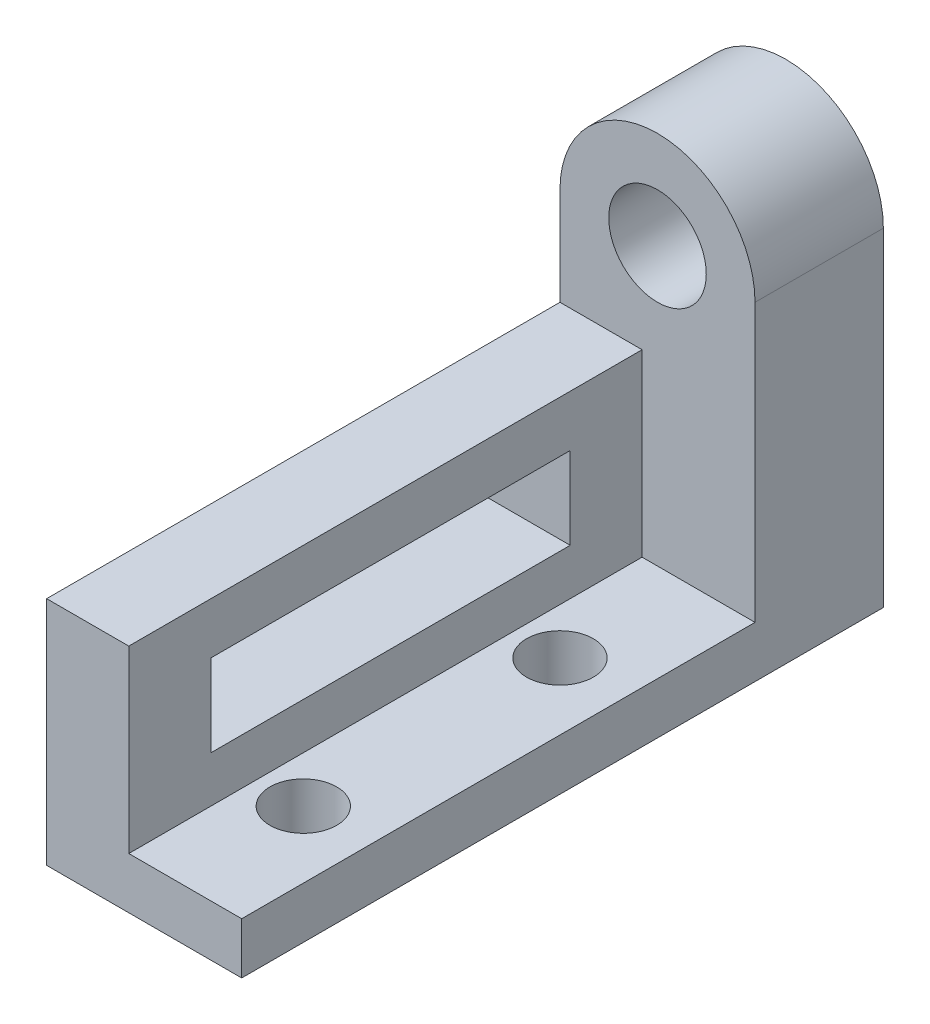
ISO-10303-21;
HEADER;
FILE_DESCRIPTION(('STEP AP214'),'2;1');
FILE_NAME('part.step','',(''),(''),'','','');
FILE_SCHEMA(('AUTOMOTIVE_DESIGN { 1 0 10303 214 1 1 1 1 }'));
ENDSEC;
DATA;
#1=APPLICATION_CONTEXT('core data for automotive mechanical design processes');
#2=APPLICATION_PROTOCOL_DEFINITION('international standard','automotive_design',2000,#1);
#3=PRODUCT_CONTEXT('',#1,'mechanical');
#4=PRODUCT('Part','Part','',(#3));
#5=PRODUCT_RELATED_PRODUCT_CATEGORY('part','',(#4));
#6=PRODUCT_DEFINITION_FORMATION('','',#4);
#7=PRODUCT_DEFINITION_CONTEXT('part definition',#1,'design');
#8=PRODUCT_DEFINITION('design','',#6,#7);
#9=PRODUCT_DEFINITION_SHAPE('','',#8);
#10=(LENGTH_UNIT() NAMED_UNIT(*) SI_UNIT(.MILLI.,.METRE.));
#11=(NAMED_UNIT(*) PLANE_ANGLE_UNIT() SI_UNIT($,.RADIAN.));
#12=(NAMED_UNIT(*) SI_UNIT($,.STERADIAN.) SOLID_ANGLE_UNIT());
#13=UNCERTAINTY_MEASURE_WITH_UNIT(LENGTH_MEASURE(1.E-05),#10,'distance_accuracy_value','');
#14=(GEOMETRIC_REPRESENTATION_CONTEXT(3) GLOBAL_UNCERTAINTY_ASSIGNED_CONTEXT((#13)) GLOBAL_UNIT_ASSIGNED_CONTEXT((#10,
#11,#12)) REPRESENTATION_CONTEXT('',''));
#15=CARTESIAN_POINT('',(0.,0.,0.));
#16=DIRECTION('',(0.,0.,1.));
#17=DIRECTION('',(1.,0.,0.));
#18=AXIS2_PLACEMENT_3D('',#15,#16,#17);
#19=CARTESIAN_POINT('',(19.,64.,-125.));
#20=DIRECTION('',(0.,0.,-1.));
#21=DIRECTION('',(-1.,0.,0.));
#22=AXIS2_PLACEMENT_3D('',#19,#20,#21);
#23=CYLINDRICAL_SURFACE('',#22,19.);
#24=DIRECTION('',(0.,0.,-1.));
#25=VECTOR('',#24,1.);
#26=CARTESIAN_POINT('',(38.,64.,0.));
#27=LINE('',#26,#25);
#28=CARTESIAN_POINT('',(38.,64.,-125.));
#29=VERTEX_POINT('',#28);
#30=CARTESIAN_POINT('',(38.,64.,-100.));
#31=VERTEX_POINT('',#30);
#32=EDGE_CURVE('E226',#29,#31,#27,.F.);
#33=ORIENTED_EDGE('',*,*,#32,.F.);
#34=CARTESIAN_POINT('',(19.,64.,-125.));
#35=DIRECTION('',(0.,0.,1.));
#36=DIRECTION('',(1.,0.,0.));
#37=AXIS2_PLACEMENT_3D('',#34,#35,#36);
#38=CIRCLE('',#37,19.);
#39=CARTESIAN_POINT('',(0.,64.,-125.));
#40=VERTEX_POINT('',#39);
#41=EDGE_CURVE('E50',#40,#29,#38,.F.);
#42=ORIENTED_EDGE('',*,*,#41,.F.);
#43=DIRECTION('',(0.,0.,1.));
#44=VECTOR('',#43,1.);
#45=CARTESIAN_POINT('',(0.,64.,-125.));
#46=LINE('',#45,#44);
#47=CARTESIAN_POINT('',(0.,64.,-100.));
#48=VERTEX_POINT('',#47);
#49=EDGE_CURVE('E229',#48,#40,#46,.F.);
#50=ORIENTED_EDGE('',*,*,#49,.F.);
#51=CARTESIAN_POINT('',(19.,64.,-100.));
#52=DIRECTION('',(0.,0.,1.));
#53=DIRECTION('',(1.,0.,0.));
#54=AXIS2_PLACEMENT_3D('',#51,#52,#53);
#55=CIRCLE('',#54,19.);
#56=EDGE_CURVE('E11',#31,#48,#55,.T.);
#57=ORIENTED_EDGE('',*,*,#56,.F.);
#58=EDGE_LOOP('',(#33,#42,#50,#57));
#59=FACE_BOUND('',#58,.T.);
#60=ADVANCED_FACE('F43',(#59),#23,.T.);
#61=CARTESIAN_POINT('',(38.,0.,-100.));
#62=DIRECTION('',(0.,0.,1.));
#63=DIRECTION('',(1.,0.,0.));
#64=AXIS2_PLACEMENT_3D('',#61,#62,#63);
#65=PLANE('',#64);
#66=CARTESIAN_POINT('',(19.,64.,-100.));
#67=DIRECTION('',(0.,0.,1.));
#68=DIRECTION('',(1.,0.,0.));
#69=AXIS2_PLACEMENT_3D('',#66,#67,#68);
#70=CIRCLE('',#69,9.5);
#71=CARTESIAN_POINT('',(28.5,64.,-100.));
#72=VERTEX_POINT('',#71);
#73=EDGE_CURVE('E433',#72,#72,#70,.T.);
#74=ORIENTED_EDGE('',*,*,#73,.F.);
#75=EDGE_LOOP('',(#74));
#76=FACE_BOUND('',#75,.T.);
#77=DIRECTION('',(0.,1.,0.));
#78=VECTOR('',#77,1.);
#79=CARTESIAN_POINT('',(38.,0.,-100.));
#80=LINE('',#79,#78);
#81=CARTESIAN_POINT('',(38.,10.,-100.));
#82=VERTEX_POINT('',#81);
#83=EDGE_CURVE('E196',#82,#31,#80,.T.);
#84=ORIENTED_EDGE('',*,*,#83,.T.);
#85=ORIENTED_EDGE('',*,*,#56,.T.);
#86=DIRECTION('',(0.,1.,0.));
#87=VECTOR('',#86,1.);
#88=CARTESIAN_POINT('',(0.,0.,-100.));
#89=LINE('',#88,#87);
#90=CARTESIAN_POINT('',(0.,45.,-100.));
#91=VERTEX_POINT('',#90);
#92=EDGE_CURVE('E194',#91,#48,#89,.T.);
#93=ORIENTED_EDGE('',*,*,#92,.F.);
#94=DIRECTION('',(-1.,0.,0.));
#95=VECTOR('',#94,1.);
#96=CARTESIAN_POINT('',(16.,45.,-100.));
#97=LINE('',#96,#95);
#98=CARTESIAN_POINT('',(16.,45.,-100.));
#99=VERTEX_POINT('',#98);
#100=EDGE_CURVE('E141',#99,#91,#97,.T.);
#101=ORIENTED_EDGE('',*,*,#100,.F.);
#102=DIRECTION('',(0.,1.,0.));
#103=VECTOR('',#102,1.);
#104=CARTESIAN_POINT('',(16.,0.,-100.));
#105=LINE('',#104,#103);
#106=CARTESIAN_POINT('',(16.,10.,-100.));
#107=VERTEX_POINT('',#106);
#108=EDGE_CURVE('E149',#107,#99,#105,.T.);
#109=ORIENTED_EDGE('',*,*,#108,.F.);
#110=DIRECTION('',(-1.,0.,0.));
#111=VECTOR('',#110,1.);
#112=CARTESIAN_POINT('',(38.,10.,-100.));
#113=LINE('',#112,#111);
#114=EDGE_CURVE('E223',#82,#107,#113,.T.);
#115=ORIENTED_EDGE('',*,*,#114,.F.);
#116=EDGE_LOOP('',(#84,#85,#93,#101,#109,#115));
#117=FACE_BOUND('',#116,.T.);
#118=ADVANCED_FACE('F247',(#76,#117),#65,.T.);
#119=CARTESIAN_POINT('',(38.,10.,0.));
#120=DIRECTION('',(0.,1.,0.));
#121=DIRECTION('',(0.,0.,1.));
#122=AXIS2_PLACEMENT_3D('',#119,#120,#121);
#123=PLANE('',#122);
#124=CARTESIAN_POINT('',(25.,10.,-25.));
#125=DIRECTION('',(0.,1.,0.));
#126=DIRECTION('',(0.,0.,1.));
#127=AXIS2_PLACEMENT_3D('',#124,#125,#126);
#128=CIRCLE('',#127,6.5);
#129=CARTESIAN_POINT('',(25.,10.,-18.5));
#130=VERTEX_POINT('',#129);
#131=EDGE_CURVE('E423',#130,#130,#128,.T.);
#132=ORIENTED_EDGE('',*,*,#131,.F.);
#133=EDGE_LOOP('',(#132));
#134=FACE_BOUND('',#133,.T.);
#135=CARTESIAN_POINT('',(25.,10.,-75.));
#136=DIRECTION('',(0.,1.,0.));
#137=DIRECTION('',(0.,0.,1.));
#138=AXIS2_PLACEMENT_3D('',#135,#136,#137);
#139=CIRCLE('',#138,6.5);
#140=CARTESIAN_POINT('',(25.,10.,-68.5));
#141=VERTEX_POINT('',#140);
#142=EDGE_CURVE('E425',#141,#141,#139,.T.);
#143=ORIENTED_EDGE('',*,*,#142,.F.);
#144=EDGE_LOOP('',(#143));
#145=FACE_BOUND('',#144,.T.);
#146=DIRECTION('',(0.,0.,-1.));
#147=VECTOR('',#146,1.);
#148=CARTESIAN_POINT('',(16.,10.,0.));
#149=LINE('',#148,#147);
#150=CARTESIAN_POINT('',(16.,10.,0.));
#151=VERTEX_POINT('',#150);
#152=EDGE_CURVE('E156',#151,#107,#149,.T.);
#153=ORIENTED_EDGE('',*,*,#152,.F.);
#154=DIRECTION('',(-1.,0.,0.));
#155=VECTOR('',#154,1.);
#156=CARTESIAN_POINT('',(38.,10.,0.));
#157=LINE('',#156,#155);
#158=CARTESIAN_POINT('',(38.,10.,0.));
#159=VERTEX_POINT('',#158);
#160=EDGE_CURVE('E155',#159,#151,#157,.T.);
#161=ORIENTED_EDGE('',*,*,#160,.F.);
#162=DIRECTION('',(0.,0.,-1.));
#163=VECTOR('',#162,1.);
#164=CARTESIAN_POINT('',(38.,10.,0.));
#165=LINE('',#164,#163);
#166=EDGE_CURVE('E198',#159,#82,#165,.T.);
#167=ORIENTED_EDGE('',*,*,#166,.T.);
#168=ORIENTED_EDGE('',*,*,#114,.T.);
#169=EDGE_LOOP('',(#153,#161,#167,#168));
#170=FACE_BOUND('',#169,.T.);
#171=ADVANCED_FACE('F249',(#134,#145,#170),#123,.T.);
#172=CARTESIAN_POINT('',(38.,0.,0.));
#173=DIRECTION('',(0.,0.,1.));
#174=DIRECTION('',(1.,0.,0.));
#175=AXIS2_PLACEMENT_3D('',#172,#173,#174);
#176=PLANE('',#175);
#177=DIRECTION('',(0.,1.,0.));
#178=VECTOR('',#177,1.);
#179=CARTESIAN_POINT('',(0.,0.,0.));
#180=LINE('',#179,#178);
#181=CARTESIAN_POINT('',(0.,0.,0.));
#182=VERTEX_POINT('',#181);
#183=CARTESIAN_POINT('',(0.,45.,0.));
#184=VERTEX_POINT('',#183);
#185=EDGE_CURVE('E212',#182,#184,#180,.T.);
#186=ORIENTED_EDGE('',*,*,#185,.F.);
#187=DIRECTION('',(-1.,0.,0.));
#188=VECTOR('',#187,1.);
#189=CARTESIAN_POINT('',(38.,0.,0.));
#190=LINE('',#189,#188);
#191=CARTESIAN_POINT('',(38.,0.,0.));
#192=VERTEX_POINT('',#191);
#193=EDGE_CURVE('E220',#192,#182,#190,.T.);
#194=ORIENTED_EDGE('',*,*,#193,.F.);
#195=DIRECTION('',(0.,1.,0.));
#196=VECTOR('',#195,1.);
#197=CARTESIAN_POINT('',(38.,0.,0.));
#198=LINE('',#197,#196);
#199=EDGE_CURVE('E202',#192,#159,#198,.T.);
#200=ORIENTED_EDGE('',*,*,#199,.T.);
#201=ORIENTED_EDGE('',*,*,#160,.T.);
#202=DIRECTION('',(0.,1.,0.));
#203=VECTOR('',#202,1.);
#204=CARTESIAN_POINT('',(16.,0.,0.));
#205=LINE('',#204,#203);
#206=CARTESIAN_POINT('',(16.,45.,0.));
#207=VERTEX_POINT('',#206);
#208=EDGE_CURVE('E146',#151,#207,#205,.T.);
#209=ORIENTED_EDGE('',*,*,#208,.T.);
#210=DIRECTION('',(-1.,0.,0.));
#211=VECTOR('',#210,1.);
#212=CARTESIAN_POINT('',(16.,45.,0.));
#213=LINE('',#212,#211);
#214=EDGE_CURVE('E130',#207,#184,#213,.T.);
#215=ORIENTED_EDGE('',*,*,#214,.T.);
#216=EDGE_LOOP('',(#186,#194,#200,#201,#209,#215));
#217=FACE_BOUND('',#216,.T.);
#218=ADVANCED_FACE('F153',(#217),#176,.T.);
#219=CARTESIAN_POINT('',(38.,0.,0.));
#220=DIRECTION('',(0.,1.,0.));
#221=DIRECTION('',(0.,0.,1.));
#222=AXIS2_PLACEMENT_3D('',#219,#220,#221);
#223=PLANE('',#222);
#224=CARTESIAN_POINT('',(25.,0.,-25.));
#225=DIRECTION('',(0.,1.,0.));
#226=DIRECTION('',(0.,0.,1.));
#227=AXIS2_PLACEMENT_3D('',#224,#225,#226);
#228=CIRCLE('',#227,6.5);
#229=CARTESIAN_POINT('',(25.,0.,-18.5));
#230=VERTEX_POINT('',#229);
#231=EDGE_CURVE('E421',#230,#230,#228,.T.);
#232=ORIENTED_EDGE('',*,*,#231,.T.);
#233=EDGE_LOOP('',(#232));
#234=FACE_BOUND('',#233,.T.);
#235=CARTESIAN_POINT('',(25.,0.,-75.));
#236=DIRECTION('',(0.,1.,0.));
#237=DIRECTION('',(0.,0.,1.));
#238=AXIS2_PLACEMENT_3D('',#235,#236,#237);
#239=CIRCLE('',#238,6.5);
#240=CARTESIAN_POINT('',(25.,0.,-68.5));
#241=VERTEX_POINT('',#240);
#242=EDGE_CURVE('E430',#241,#241,#239,.T.);
#243=ORIENTED_EDGE('',*,*,#242,.T.);
#244=EDGE_LOOP('',(#243));
#245=FACE_BOUND('',#244,.T.);
#246=DIRECTION('',(0.,0.,-1.));
#247=VECTOR('',#246,1.);
#248=CARTESIAN_POINT('',(0.,0.,0.));
#249=LINE('',#248,#247);
#250=CARTESIAN_POINT('',(0.,0.,-125.));
#251=VERTEX_POINT('',#250);
#252=EDGE_CURVE('E214',#182,#251,#249,.T.);
#253=ORIENTED_EDGE('',*,*,#252,.T.);
#254=DIRECTION('',(-1.,0.,0.));
#255=VECTOR('',#254,1.);
#256=CARTESIAN_POINT('',(38.,0.,-125.));
#257=LINE('',#256,#255);
#258=CARTESIAN_POINT('',(38.,0.,-125.));
#259=VERTEX_POINT('',#258);
#260=EDGE_CURVE('E209',#259,#251,#257,.T.);
#261=ORIENTED_EDGE('',*,*,#260,.F.);
#262=DIRECTION('',(0.,0.,-1.));
#263=VECTOR('',#262,1.);
#264=CARTESIAN_POINT('',(38.,0.,0.));
#265=LINE('',#264,#263);
#266=EDGE_CURVE('E204',#192,#259,#265,.T.);
#267=ORIENTED_EDGE('',*,*,#266,.F.);
#268=ORIENTED_EDGE('',*,*,#193,.T.);
#269=EDGE_LOOP('',(#253,#261,#267,#268));
#270=FACE_BOUND('',#269,.T.);
#271=ADVANCED_FACE('F242',(#234,#245,#270),#223,.F.);
#272=CARTESIAN_POINT('',(38.,0.,-125.));
#273=DIRECTION('',(0.,0.,1.));
#274=DIRECTION('',(1.,0.,0.));
#275=AXIS2_PLACEMENT_3D('',#272,#273,#274);
#276=PLANE('',#275);
#277=CARTESIAN_POINT('',(19.,64.,-125.));
#278=DIRECTION('',(0.,0.,1.));
#279=DIRECTION('',(1.,0.,0.));
#280=AXIS2_PLACEMENT_3D('',#277,#278,#279);
#281=CIRCLE('',#280,9.49999999999999);
#282=CARTESIAN_POINT('',(28.5,64.,-125.));
#283=VERTEX_POINT('',#282);
#284=EDGE_CURVE('E175',#283,#283,#281,.T.);
#285=ORIENTED_EDGE('',*,*,#284,.T.);
#286=EDGE_LOOP('',(#285));
#287=FACE_BOUND('',#286,.T.);
#288=DIRECTION('',(0.,1.,0.));
#289=VECTOR('',#288,1.);
#290=CARTESIAN_POINT('',(0.,0.,-125.));
#291=LINE('',#290,#289);
#292=EDGE_CURVE('E199',#251,#40,#291,.T.);
#293=ORIENTED_EDGE('',*,*,#292,.T.);
#294=ORIENTED_EDGE('',*,*,#41,.T.);
#295=DIRECTION('',(0.,1.,0.));
#296=VECTOR('',#295,1.);
#297=CARTESIAN_POINT('',(38.,0.,-125.));
#298=LINE('',#297,#296);
#299=EDGE_CURVE('E206',#259,#29,#298,.T.);
#300=ORIENTED_EDGE('',*,*,#299,.F.);
#301=ORIENTED_EDGE('',*,*,#260,.T.);
#302=EDGE_LOOP('',(#293,#294,#300,#301));
#303=FACE_BOUND('',#302,.T.);
#304=ADVANCED_FACE('F232',(#287,#303),#276,.F.);
#305=CARTESIAN_POINT('',(38.,0.,0.));
#306=DIRECTION('',(1.,0.,0.));
#307=DIRECTION('',(0.,0.,-1.));
#308=AXIS2_PLACEMENT_3D('',#305,#306,#307);
#309=PLANE('',#308);
#310=ORIENTED_EDGE('',*,*,#299,.T.);
#311=ORIENTED_EDGE('',*,*,#32,.T.);
#312=ORIENTED_EDGE('',*,*,#83,.F.);
#313=ORIENTED_EDGE('',*,*,#166,.F.);
#314=ORIENTED_EDGE('',*,*,#199,.F.);
#315=ORIENTED_EDGE('',*,*,#266,.T.);
#316=EDGE_LOOP('',(#310,#311,#312,#313,#314,#315));
#317=FACE_BOUND('',#316,.T.);
#318=ADVANCED_FACE('F236',(#317),#309,.T.);
#319=CARTESIAN_POINT('',(0.,0.,0.));
#320=DIRECTION('',(1.,0.,0.));
#321=DIRECTION('',(0.,0.,-1.));
#322=AXIS2_PLACEMENT_3D('',#319,#320,#321);
#323=PLANE('',#322);
#324=ORIENTED_EDGE('',*,*,#92,.T.);
#325=ORIENTED_EDGE('',*,*,#49,.T.);
#326=ORIENTED_EDGE('',*,*,#292,.F.);
#327=ORIENTED_EDGE('',*,*,#252,.F.);
#328=ORIENTED_EDGE('',*,*,#185,.T.);
#329=DIRECTION('',(0.,0.,-1.));
#330=VECTOR('',#329,1.);
#331=CARTESIAN_POINT('',(0.,45.,0.));
#332=LINE('',#331,#330);
#333=EDGE_CURVE('E136',#184,#91,#332,.T.);
#334=ORIENTED_EDGE('',*,*,#333,.T.);
#335=EDGE_LOOP('',(#324,#325,#326,#327,#328,#334));
#336=FACE_BOUND('',#335,.T.);
#337=DIRECTION('',(0.,0.,-1.));
#338=VECTOR('',#337,1.);
#339=CARTESIAN_POINT('',(0.,35.,0.));
#340=LINE('',#339,#338);
#341=CARTESIAN_POINT('',(0.,35.,-16.));
#342=VERTEX_POINT('',#341);
#343=CARTESIAN_POINT('',(0.,35.,-86.));
#344=VERTEX_POINT('',#343);
#345=EDGE_CURVE('E174',#342,#344,#340,.T.);
#346=ORIENTED_EDGE('',*,*,#345,.F.);
#347=DIRECTION('',(0.,-1.,0.));
#348=VECTOR('',#347,1.);
#349=CARTESIAN_POINT('',(0.,0.,-16.));
#350=LINE('',#349,#348);
#351=CARTESIAN_POINT('',(0.,19.,-16.));
#352=VERTEX_POINT('',#351);
#353=EDGE_CURVE('E150',#342,#352,#350,.T.);
#354=ORIENTED_EDGE('',*,*,#353,.T.);
#355=DIRECTION('',(0.,0.,-1.));
#356=VECTOR('',#355,1.);
#357=CARTESIAN_POINT('',(0.,19.,0.));
#358=LINE('',#357,#356);
#359=CARTESIAN_POINT('',(0.,19.,-86.));
#360=VERTEX_POINT('',#359);
#361=EDGE_CURVE('E181',#352,#360,#358,.T.);
#362=ORIENTED_EDGE('',*,*,#361,.T.);
#363=DIRECTION('',(0.,-1.,0.));
#364=VECTOR('',#363,1.);
#365=CARTESIAN_POINT('',(0.,0.,-86.));
#366=LINE('',#365,#364);
#367=EDGE_CURVE('E178',#344,#360,#366,.T.);
#368=ORIENTED_EDGE('',*,*,#367,.F.);
#369=EDGE_LOOP('',(#346,#354,#362,#368));
#370=FACE_BOUND('',#369,.T.);
#371=ADVANCED_FACE('F245',(#336,#370),#323,.F.);
#372=CARTESIAN_POINT('',(16.,35.,0.));
#373=DIRECTION('',(0.,1.,0.));
#374=DIRECTION('',(0.,0.,1.));
#375=AXIS2_PLACEMENT_3D('',#372,#373,#374);
#376=PLANE('',#375);
#377=ORIENTED_EDGE('',*,*,#345,.T.);
#378=DIRECTION('',(-1.,0.,0.));
#379=VECTOR('',#378,1.);
#380=CARTESIAN_POINT('',(16.,35.,-86.));
#381=LINE('',#380,#379);
#382=CARTESIAN_POINT('',(16.,35.,-86.));
#383=VERTEX_POINT('',#382);
#384=EDGE_CURVE('E191',#383,#344,#381,.T.);
#385=ORIENTED_EDGE('',*,*,#384,.F.);
#386=DIRECTION('',(0.,0.,-1.));
#387=VECTOR('',#386,1.);
#388=CARTESIAN_POINT('',(16.,35.,0.));
#389=LINE('',#388,#387);
#390=CARTESIAN_POINT('',(16.,35.,-16.));
#391=VERTEX_POINT('',#390);
#392=EDGE_CURVE('E162',#391,#383,#389,.T.);
#393=ORIENTED_EDGE('',*,*,#392,.F.);
#394=DIRECTION('',(-1.,0.,0.));
#395=VECTOR('',#394,1.);
#396=CARTESIAN_POINT('',(16.,35.,-16.));
#397=LINE('',#396,#395);
#398=EDGE_CURVE('E140',#391,#342,#397,.T.);
#399=ORIENTED_EDGE('',*,*,#398,.T.);
#400=EDGE_LOOP('',(#377,#385,#393,#399));
#401=FACE_BOUND('',#400,.T.);
#402=ADVANCED_FACE('F349',(#401),#376,.F.);
#403=CARTESIAN_POINT('',(16.,0.,-86.));
#404=DIRECTION('',(0.,0.,-1.));
#405=DIRECTION('',(-1.,0.,0.));
#406=AXIS2_PLACEMENT_3D('',#403,#404,#405);
#407=PLANE('',#406);
#408=ORIENTED_EDGE('',*,*,#367,.T.);
#409=DIRECTION('',(-1.,0.,0.));
#410=VECTOR('',#409,1.);
#411=CARTESIAN_POINT('',(16.,19.,-86.));
#412=LINE('',#411,#410);
#413=CARTESIAN_POINT('',(16.,19.,-86.));
#414=VERTEX_POINT('',#413);
#415=EDGE_CURVE('E189',#414,#360,#412,.T.);
#416=ORIENTED_EDGE('',*,*,#415,.F.);
#417=DIRECTION('',(0.,-1.,0.));
#418=VECTOR('',#417,1.);
#419=CARTESIAN_POINT('',(16.,0.,-86.));
#420=LINE('',#419,#418);
#421=EDGE_CURVE('E165',#383,#414,#420,.T.);
#422=ORIENTED_EDGE('',*,*,#421,.F.);
#423=ORIENTED_EDGE('',*,*,#384,.T.);
#424=EDGE_LOOP('',(#408,#416,#422,#423));
#425=FACE_BOUND('',#424,.T.);
#426=ADVANCED_FACE('F345',(#425),#407,.F.);
#427=CARTESIAN_POINT('',(16.,19.,0.));
#428=DIRECTION('',(0.,1.,0.));
#429=DIRECTION('',(0.,0.,1.));
#430=AXIS2_PLACEMENT_3D('',#427,#428,#429);
#431=PLANE('',#430);
#432=ORIENTED_EDGE('',*,*,#361,.F.);
#433=DIRECTION('',(-1.,0.,0.));
#434=VECTOR('',#433,1.);
#435=CARTESIAN_POINT('',(16.,19.,-16.));
#436=LINE('',#435,#434);
#437=CARTESIAN_POINT('',(16.,19.,-16.));
#438=VERTEX_POINT('',#437);
#439=EDGE_CURVE('E187',#438,#352,#436,.T.);
#440=ORIENTED_EDGE('',*,*,#439,.F.);
#441=DIRECTION('',(0.,0.,-1.));
#442=VECTOR('',#441,1.);
#443=CARTESIAN_POINT('',(16.,19.,0.));
#444=LINE('',#443,#442);
#445=EDGE_CURVE('E167',#438,#414,#444,.T.);
#446=ORIENTED_EDGE('',*,*,#445,.T.);
#447=ORIENTED_EDGE('',*,*,#415,.T.);
#448=EDGE_LOOP('',(#432,#440,#446,#447));
#449=FACE_BOUND('',#448,.T.);
#450=ADVANCED_FACE('F342',(#449),#431,.T.);
#451=CARTESIAN_POINT('',(16.,45.,0.));
#452=DIRECTION('',(0.,1.,0.));
#453=DIRECTION('',(0.,0.,1.));
#454=AXIS2_PLACEMENT_3D('',#451,#452,#453);
#455=PLANE('',#454);
#456=ORIENTED_EDGE('',*,*,#333,.F.);
#457=ORIENTED_EDGE('',*,*,#214,.F.);
#458=DIRECTION('',(0.,0.,-1.));
#459=VECTOR('',#458,1.);
#460=CARTESIAN_POINT('',(16.,45.,0.));
#461=LINE('',#460,#459);
#462=EDGE_CURVE('E134',#207,#99,#461,.T.);
#463=ORIENTED_EDGE('',*,*,#462,.T.);
#464=ORIENTED_EDGE('',*,*,#100,.T.);
#465=EDGE_LOOP('',(#456,#457,#463,#464));
#466=FACE_BOUND('',#465,.T.);
#467=ADVANCED_FACE('F132',(#466),#455,.T.);
#468=CARTESIAN_POINT('',(16.,0.,-16.));
#469=DIRECTION('',(0.,0.,-1.));
#470=DIRECTION('',(0.,1.,0.));
#471=AXIS2_PLACEMENT_3D('',#468,#469,#470);
#472=PLANE('',#471);
#473=ORIENTED_EDGE('',*,*,#353,.F.);
#474=ORIENTED_EDGE('',*,*,#398,.F.);
#475=DIRECTION('',(0.,-1.,0.));
#476=VECTOR('',#475,1.);
#477=CARTESIAN_POINT('',(16.,0.,-16.));
#478=LINE('',#477,#476);
#479=EDGE_CURVE('E170',#391,#438,#478,.T.);
#480=ORIENTED_EDGE('',*,*,#479,.T.);
#481=ORIENTED_EDGE('',*,*,#439,.T.);
#482=EDGE_LOOP('',(#473,#474,#480,#481));
#483=FACE_BOUND('',#482,.T.);
#484=ADVANCED_FACE('F338',(#483),#472,.T.);
#485=CARTESIAN_POINT('',(16.,0.,0.));
#486=DIRECTION('',(1.,0.,0.));
#487=DIRECTION('',(0.,0.,-1.));
#488=AXIS2_PLACEMENT_3D('',#485,#486,#487);
#489=PLANE('',#488);
#490=ORIENTED_EDGE('',*,*,#462,.F.);
#491=ORIENTED_EDGE('',*,*,#208,.F.);
#492=ORIENTED_EDGE('',*,*,#152,.T.);
#493=ORIENTED_EDGE('',*,*,#108,.T.);
#494=EDGE_LOOP('',(#490,#491,#492,#493));
#495=FACE_BOUND('',#494,.T.);
#496=ORIENTED_EDGE('',*,*,#392,.T.);
#497=ORIENTED_EDGE('',*,*,#421,.T.);
#498=ORIENTED_EDGE('',*,*,#445,.F.);
#499=ORIENTED_EDGE('',*,*,#479,.F.);
#500=EDGE_LOOP('',(#496,#497,#498,#499));
#501=FACE_BOUND('',#500,.T.);
#502=ADVANCED_FACE('F144',(#495,#501),#489,.T.);
#503=CARTESIAN_POINT('',(19.,64.,-100.));
#504=DIRECTION('',(0.,0.,1.));
#505=DIRECTION('',(1.,0.,0.));
#506=AXIS2_PLACEMENT_3D('',#503,#504,#505);
#507=CYLINDRICAL_SURFACE('',#506,9.49999999999999);
#508=ORIENTED_EDGE('',*,*,#284,.F.);
#509=EDGE_LOOP('',(#508));
#510=FACE_BOUND('',#509,.T.);
#511=ORIENTED_EDGE('',*,*,#73,.T.);
#512=EDGE_LOOP('',(#511));
#513=FACE_BOUND('',#512,.T.);
#514=ADVANCED_FACE('F293',(#510,#513),#507,.F.);
#515=CARTESIAN_POINT('',(25.,10.,-75.));
#516=DIRECTION('',(0.,1.,0.));
#517=DIRECTION('',(0.,0.,1.));
#518=AXIS2_PLACEMENT_3D('',#515,#516,#517);
#519=CYLINDRICAL_SURFACE('',#518,6.5);
#520=ORIENTED_EDGE('',*,*,#242,.F.);
#521=EDGE_LOOP('',(#520));
#522=FACE_BOUND('',#521,.T.);
#523=ORIENTED_EDGE('',*,*,#142,.T.);
#524=EDGE_LOOP('',(#523));
#525=FACE_BOUND('',#524,.T.);
#526=ADVANCED_FACE('F297',(#522,#525),#519,.F.);
#527=CARTESIAN_POINT('',(25.,10.,-25.));
#528=DIRECTION('',(0.,1.,0.));
#529=DIRECTION('',(0.,0.,1.));
#530=AXIS2_PLACEMENT_3D('',#527,#528,#529);
#531=CYLINDRICAL_SURFACE('',#530,6.5);
#532=ORIENTED_EDGE('',*,*,#231,.F.);
#533=EDGE_LOOP('',(#532));
#534=FACE_BOUND('',#533,.T.);
#535=ORIENTED_EDGE('',*,*,#131,.T.);
#536=EDGE_LOOP('',(#535));
#537=FACE_BOUND('',#536,.T.);
#538=ADVANCED_FACE('F320',(#534,#537),#531,.F.);
#539=CLOSED_SHELL('',(#60,#118,#171,#218,#271,#304,#318,#371,#402,#426,#450,#467,#484,#502,#514,
#526,#538));
#540=MANIFOLD_SOLID_BREP('B2',#539);
#541=ADVANCED_BREP_SHAPE_REPRESENTATION('',(#18,#540),#14);
#542=SHAPE_DEFINITION_REPRESENTATION(#9,#541);
ENDSEC;
END-ISO-10303-21;
